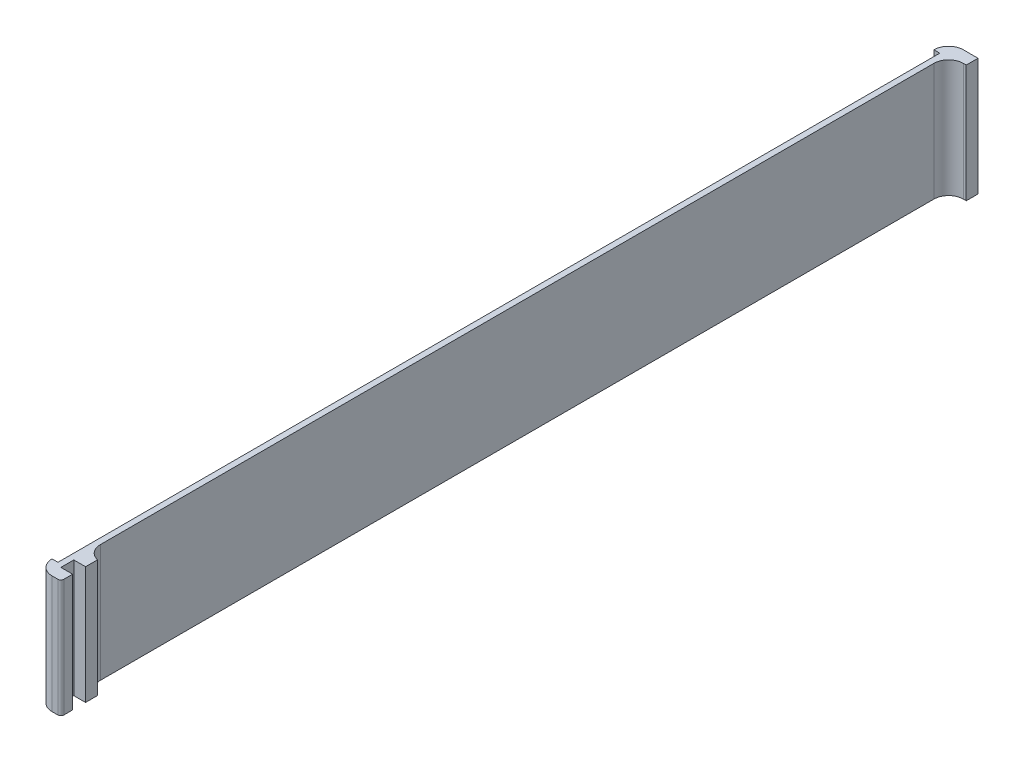
ISO-10303-21;
HEADER;
FILE_DESCRIPTION(('STEP AP214'),'2;1');
FILE_NAME('part.step','',(''),(''),'','','');
FILE_SCHEMA(('AUTOMOTIVE_DESIGN { 1 0 10303 214 1 1 1 1 }'));
ENDSEC;
DATA;
#1=APPLICATION_CONTEXT('core data for automotive mechanical design processes');
#2=APPLICATION_PROTOCOL_DEFINITION('international standard','automotive_design',2000,#1);
#3=PRODUCT_CONTEXT('',#1,'mechanical');
#4=PRODUCT('Part','Part','',(#3));
#5=PRODUCT_RELATED_PRODUCT_CATEGORY('part','',(#4));
#6=PRODUCT_DEFINITION_FORMATION('','',#4);
#7=PRODUCT_DEFINITION_CONTEXT('part definition',#1,'design');
#8=PRODUCT_DEFINITION('design','',#6,#7);
#9=PRODUCT_DEFINITION_SHAPE('','',#8);
#10=(LENGTH_UNIT() NAMED_UNIT(*) SI_UNIT(.MILLI.,.METRE.));
#11=(NAMED_UNIT(*) PLANE_ANGLE_UNIT() SI_UNIT($,.RADIAN.));
#12=(NAMED_UNIT(*) SI_UNIT($,.STERADIAN.) SOLID_ANGLE_UNIT());
#13=UNCERTAINTY_MEASURE_WITH_UNIT(LENGTH_MEASURE(1.E-05),#10,'distance_accuracy_value','');
#14=(GEOMETRIC_REPRESENTATION_CONTEXT(3) GLOBAL_UNCERTAINTY_ASSIGNED_CONTEXT((#13)) GLOBAL_UNIT_ASSIGNED_CONTEXT((#10,
#11,#12)) REPRESENTATION_CONTEXT('',''));
#15=CARTESIAN_POINT('',(0.,0.,0.));
#16=DIRECTION('',(0.,0.,1.));
#17=DIRECTION('',(1.,0.,0.));
#18=AXIS2_PLACEMENT_3D('',#15,#16,#17);
#19=CARTESIAN_POINT('',(-19.5,2.,-77.5));
#20=DIRECTION('',(0.,0.,1.));
#21=DIRECTION('',(1.,0.,0.));
#22=AXIS2_PLACEMENT_3D('',#19,#20,#21);
#23=PLANE('',#22);
#24=DIRECTION('',(0.,-1.,0.));
#25=VECTOR('',#24,1.);
#26=CARTESIAN_POINT('',(-17.,2.,-77.5));
#27=LINE('',#26,#25);
#28=CARTESIAN_POINT('',(-17.,10.,-77.5));
#29=VERTEX_POINT('',#28);
#30=CARTESIAN_POINT('',(-17.,30.,-77.5));
#31=VERTEX_POINT('',#30);
#32=EDGE_CURVE('E329',#29,#31,#27,.F.);
#33=ORIENTED_EDGE('',*,*,#32,.T.);
#34=DIRECTION('',(1.,0.,0.));
#35=VECTOR('',#34,1.);
#36=CARTESIAN_POINT('',(-19.5,30.,-77.5));
#37=LINE('',#36,#35);
#38=CARTESIAN_POINT('',(-14.5,30.,-77.5));
#39=VERTEX_POINT('',#38);
#40=EDGE_CURVE('E238',#31,#39,#37,.T.);
#41=ORIENTED_EDGE('',*,*,#40,.T.);
#42=DIRECTION('',(0.,-1.,0.));
#43=VECTOR('',#42,1.);
#44=CARTESIAN_POINT('',(-14.5,2.,-77.5));
#45=LINE('',#44,#43);
#46=CARTESIAN_POINT('',(-14.5,10.,-77.5));
#47=VERTEX_POINT('',#46);
#48=EDGE_CURVE('E311',#39,#47,#45,.T.);
#49=ORIENTED_EDGE('',*,*,#48,.T.);
#50=DIRECTION('',(1.,0.,0.));
#51=VECTOR('',#50,1.);
#52=CARTESIAN_POINT('',(-19.5,10.,-77.5));
#53=LINE('',#52,#51);
#54=EDGE_CURVE('E233',#29,#47,#53,.T.);
#55=ORIENTED_EDGE('',*,*,#54,.F.);
#56=EDGE_LOOP('',(#33,#41,#49,#55));
#57=FACE_BOUND('',#56,.T.);
#58=ADVANCED_FACE('F83',(#57),#23,.F.);
#59=CARTESIAN_POINT('',(-17.5,42.8284271247462,75.5));
#60=DIRECTION('',(0.,0.,1.));
#61=DIRECTION('',(1.,0.,0.));
#62=AXIS2_PLACEMENT_3D('',#59,#60,#61);
#63=PLANE('',#62);
#64=DIRECTION('',(0.,-1.,0.));
#65=VECTOR('',#64,1.);
#66=CARTESIAN_POINT('',(-17.5,42.8284271247462,75.5));
#67=LINE('',#66,#65);
#68=CARTESIAN_POINT('',(-17.5,30.,75.5));
#69=VERTEX_POINT('',#68);
#70=CARTESIAN_POINT('',(-17.5,9.99999999999998,75.5));
#71=VERTEX_POINT('',#70);
#72=EDGE_CURVE('E320',#69,#71,#67,.T.);
#73=ORIENTED_EDGE('',*,*,#72,.F.);
#74=DIRECTION('',(1.,0.,0.));
#75=VECTOR('',#74,1.);
#76=CARTESIAN_POINT('',(-17.5,30.,75.5));
#77=LINE('',#76,#75);
#78=CARTESIAN_POINT('',(-15.5,30.,75.5));
#79=VERTEX_POINT('',#78);
#80=EDGE_CURVE('E295',#69,#79,#77,.T.);
#81=ORIENTED_EDGE('',*,*,#80,.T.);
#82=DIRECTION('',(0.,-1.,0.));
#83=VECTOR('',#82,1.);
#84=CARTESIAN_POINT('',(-15.5,42.8284271247462,75.5));
#85=LINE('',#84,#83);
#86=CARTESIAN_POINT('',(-15.5,9.99999999999998,75.5));
#87=VERTEX_POINT('',#86);
#88=EDGE_CURVE('E321',#79,#87,#85,.T.);
#89=ORIENTED_EDGE('',*,*,#88,.T.);
#90=DIRECTION('',(-1.,0.,0.));
#91=VECTOR('',#90,1.);
#92=CARTESIAN_POINT('',(-17.5,9.99999999999998,75.5));
#93=LINE('',#92,#91);
#94=EDGE_CURVE('E266',#87,#71,#93,.T.);
#95=ORIENTED_EDGE('',*,*,#94,.T.);
#96=EDGE_LOOP('',(#73,#81,#89,#95));
#97=FACE_BOUND('',#96,.T.);
#98=ADVANCED_FACE('F382',(#97),#63,.F.);
#99=CARTESIAN_POINT('',(-19.5,2.,77.5));
#100=DIRECTION('',(0.,0.,-1.));
#101=DIRECTION('',(-1.,0.,0.));
#102=AXIS2_PLACEMENT_3D('',#99,#100,#101);
#103=PLANE('',#102);
#104=DIRECTION('',(0.,-1.,0.));
#105=VECTOR('',#104,1.);
#106=CARTESIAN_POINT('',(-16.,2.,77.5));
#107=LINE('',#106,#105);
#108=CARTESIAN_POINT('',(-16.,9.99999999999998,77.5));
#109=VERTEX_POINT('',#108);
#110=CARTESIAN_POINT('',(-16.,30.,77.5));
#111=VERTEX_POINT('',#110);
#112=EDGE_CURVE('E350',#109,#111,#107,.F.);
#113=ORIENTED_EDGE('',*,*,#112,.T.);
#114=DIRECTION('',(1.,0.,0.));
#115=VECTOR('',#114,1.);
#116=CARTESIAN_POINT('',(-19.5,30.,77.5));
#117=LINE('',#116,#115);
#118=CARTESIAN_POINT('',(-17.,30.,77.5));
#119=VERTEX_POINT('',#118);
#120=EDGE_CURVE('E242',#119,#111,#117,.T.);
#121=ORIENTED_EDGE('',*,*,#120,.F.);
#122=DIRECTION('',(0.,-1.,0.));
#123=VECTOR('',#122,1.);
#124=CARTESIAN_POINT('',(-17.,2.,77.5));
#125=LINE('',#124,#123);
#126=CARTESIAN_POINT('',(-17.,9.99999999999998,77.5));
#127=VERTEX_POINT('',#126);
#128=EDGE_CURVE('E324',#119,#127,#125,.T.);
#129=ORIENTED_EDGE('',*,*,#128,.T.);
#130=DIRECTION('',(1.,0.,0.));
#131=VECTOR('',#130,1.);
#132=CARTESIAN_POINT('',(-19.5,9.99999999999998,77.5));
#133=LINE('',#132,#131);
#134=EDGE_CURVE('E244',#127,#109,#133,.T.);
#135=ORIENTED_EDGE('',*,*,#134,.T.);
#136=EDGE_LOOP('',(#113,#121,#129,#135));
#137=FACE_BOUND('',#136,.T.);
#138=ADVANCED_FACE('F387',(#137),#103,.F.);
#139=CARTESIAN_POINT('',(-17.5,42.8284271247462,73.3));
#140=DIRECTION('',(0.,0.,-1.));
#141=DIRECTION('',(-1.,0.,0.));
#142=AXIS2_PLACEMENT_3D('',#139,#140,#141);
#143=PLANE('',#142);
#144=DIRECTION('',(0.,-1.,0.));
#145=VECTOR('',#144,1.);
#146=CARTESIAN_POINT('',(-15.5,42.8284271247462,73.3));
#147=LINE('',#146,#145);
#148=CARTESIAN_POINT('',(-15.5,30.,73.3));
#149=VERTEX_POINT('',#148);
#150=CARTESIAN_POINT('',(-15.5,9.99999999999998,73.3));
#151=VERTEX_POINT('',#150);
#152=EDGE_CURVE('E317',#149,#151,#147,.T.);
#153=ORIENTED_EDGE('',*,*,#152,.F.);
#154=DIRECTION('',(-1.,0.,0.));
#155=VECTOR('',#154,1.);
#156=CARTESIAN_POINT('',(-17.5,30.,73.3));
#157=LINE('',#156,#155);
#158=CARTESIAN_POINT('',(-17.5,30.,73.3));
#159=VERTEX_POINT('',#158);
#160=EDGE_CURVE('E290',#149,#159,#157,.T.);
#161=ORIENTED_EDGE('',*,*,#160,.T.);
#162=DIRECTION('',(0.,-1.,0.));
#163=VECTOR('',#162,1.);
#164=CARTESIAN_POINT('',(-17.5,42.8284271247462,73.3));
#165=LINE('',#164,#163);
#166=CARTESIAN_POINT('',(-17.5,9.99999999999998,73.3));
#167=VERTEX_POINT('',#166);
#168=EDGE_CURVE('E314',#159,#167,#165,.T.);
#169=ORIENTED_EDGE('',*,*,#168,.T.);
#170=DIRECTION('',(1.,0.,0.));
#171=VECTOR('',#170,1.);
#172=CARTESIAN_POINT('',(-17.5,9.99999999999998,73.3));
#173=LINE('',#172,#171);
#174=EDGE_CURVE('E261',#167,#151,#173,.T.);
#175=ORIENTED_EDGE('',*,*,#174,.T.);
#176=EDGE_LOOP('',(#153,#161,#169,#175));
#177=FACE_BOUND('',#176,.T.);
#178=ADVANCED_FACE('F392',(#177),#143,.F.);
#179=CARTESIAN_POINT('',(0.,40.,-75.5));
#180=DIRECTION('',(0.,0.,-1.));
#181=DIRECTION('',(-1.,0.,0.));
#182=AXIS2_PLACEMENT_3D('',#179,#180,#181);
#183=PLANE('',#182);
#184=DIRECTION('',(0.,1.,0.));
#185=VECTOR('',#184,1.);
#186=CARTESIAN_POINT('',(-14.5,40.,-75.5));
#187=LINE('',#186,#185);
#188=CARTESIAN_POINT('',(-14.5,10.,-75.5));
#189=VERTEX_POINT('',#188);
#190=CARTESIAN_POINT('',(-14.5,30.,-75.5));
#191=VERTEX_POINT('',#190);
#192=EDGE_CURVE('E308',#189,#191,#187,.T.);
#193=ORIENTED_EDGE('',*,*,#192,.T.);
#194=DIRECTION('',(-1.,0.,0.));
#195=VECTOR('',#194,1.);
#196=CARTESIAN_POINT('',(0.,30.,-75.5));
#197=LINE('',#196,#195);
#198=CARTESIAN_POINT('',(-15.,30.,-75.5));
#199=VERTEX_POINT('',#198);
#200=EDGE_CURVE('E106',#191,#199,#197,.T.);
#201=ORIENTED_EDGE('',*,*,#200,.T.);
#202=DIRECTION('',(0.,-1.,0.));
#203=VECTOR('',#202,1.);
#204=CARTESIAN_POINT('',(-15.,40.,-75.5));
#205=LINE('',#204,#203);
#206=CARTESIAN_POINT('',(-15.,10.,-75.5));
#207=VERTEX_POINT('',#206);
#208=EDGE_CURVE('E341',#199,#207,#205,.T.);
#209=ORIENTED_EDGE('',*,*,#208,.T.);
#210=DIRECTION('',(1.,0.,0.));
#211=VECTOR('',#210,1.);
#212=CARTESIAN_POINT('',(0.,10.,-75.5));
#213=LINE('',#212,#211);
#214=EDGE_CURVE('E241',#207,#189,#213,.T.);
#215=ORIENTED_EDGE('',*,*,#214,.T.);
#216=EDGE_LOOP('',(#193,#201,#209,#215));
#217=FACE_BOUND('',#216,.T.);
#218=ADVANCED_FACE('F395',(#217),#183,.F.);
#219=CARTESIAN_POINT('',(-15.,40.,-73.));
#220=DIRECTION('',(0.,-1.,0.));
#221=DIRECTION('',(0.,0.,-1.));
#222=AXIS2_PLACEMENT_3D('',#219,#220,#221);
#223=CYLINDRICAL_SURFACE('',#222,2.5);
#224=ORIENTED_EDGE('',*,*,#208,.F.);
#225=CARTESIAN_POINT('',(-15.,30.,-73.));
#226=DIRECTION('',(0.,-1.,0.));
#227=DIRECTION('',(0.,0.,-1.));
#228=AXIS2_PLACEMENT_3D('',#225,#226,#227);
#229=CIRCLE('',#228,2.5);
#230=CARTESIAN_POINT('',(-17.5,30.,-73.));
#231=VERTEX_POINT('',#230);
#232=EDGE_CURVE('E279',#199,#231,#229,.F.);
#233=ORIENTED_EDGE('',*,*,#232,.T.);
#234=DIRECTION('',(0.,-1.,0.));
#235=VECTOR('',#234,1.);
#236=CARTESIAN_POINT('',(-17.5,40.,-73.));
#237=LINE('',#236,#235);
#238=CARTESIAN_POINT('',(-17.5,10.,-73.));
#239=VERTEX_POINT('',#238);
#240=EDGE_CURVE('E335',#239,#231,#237,.F.);
#241=ORIENTED_EDGE('',*,*,#240,.F.);
#242=CARTESIAN_POINT('',(-15.,10.,-73.));
#243=DIRECTION('',(0.,1.,0.));
#244=DIRECTION('',(0.,0.,1.));
#245=AXIS2_PLACEMENT_3D('',#242,#243,#244);
#246=CIRCLE('',#245,2.5);
#247=EDGE_CURVE('E250',#239,#207,#246,.F.);
#248=ORIENTED_EDGE('',*,*,#247,.T.);
#249=EDGE_LOOP('',(#224,#233,#241,#248));
#250=FACE_BOUND('',#249,.T.);
#251=ADVANCED_FACE('F398',(#250),#223,.F.);
#252=CARTESIAN_POINT('',(-17.5,40.,0.));
#253=DIRECTION('',(1.,0.,0.));
#254=DIRECTION('',(0.,0.,-1.));
#255=AXIS2_PLACEMENT_3D('',#252,#253,#254);
#256=PLANE('',#255);
#257=DIRECTION('',(0.,0.,-1.));
#258=VECTOR('',#257,1.);
#259=CARTESIAN_POINT('',(-17.5,30.,0.));
#260=LINE('',#259,#258);
#261=EDGE_CURVE('E293',#69,#159,#260,.T.);
#262=ORIENTED_EDGE('',*,*,#261,.F.);
#263=ORIENTED_EDGE('',*,*,#72,.T.);
#264=DIRECTION('',(0.,0.,1.));
#265=VECTOR('',#264,1.);
#266=CARTESIAN_POINT('',(-17.5,9.99999999999999,0.));
#267=LINE('',#266,#265);
#268=EDGE_CURVE('E264',#167,#71,#267,.T.);
#269=ORIENTED_EDGE('',*,*,#268,.F.);
#270=ORIENTED_EDGE('',*,*,#168,.F.);
#271=EDGE_LOOP('',(#262,#263,#269,#270));
#272=FACE_BOUND('',#271,.T.);
#273=ADVANCED_FACE('F379',(#272),#256,.T.);
#274=CARTESIAN_POINT('',(-15.5,42.8284271247462,77.5));
#275=DIRECTION('',(-1.,0.,0.));
#276=DIRECTION('',(0.,0.,1.));
#277=AXIS2_PLACEMENT_3D('',#274,#275,#276);
#278=PLANE('',#277);
#279=DIRECTION('',(0.,-1.,0.));
#280=VECTOR('',#279,1.);
#281=CARTESIAN_POINT('',(-15.5,4.,71.2494897427832));
#282=LINE('',#281,#280);
#283=CARTESIAN_POINT('',(-15.5,9.99999999999998,71.2494897427832));
#284=VERTEX_POINT('',#283);
#285=CARTESIAN_POINT('',(-15.5,30.,71.2494897427832));
#286=VERTEX_POINT('',#285);
#287=EDGE_CURVE('E344',#284,#286,#282,.F.);
#288=ORIENTED_EDGE('',*,*,#287,.T.);
#289=DIRECTION('',(0.,0.,1.));
#290=VECTOR('',#289,1.);
#291=CARTESIAN_POINT('',(-15.5,30.,77.5));
#292=LINE('',#291,#290);
#293=EDGE_CURVE('E287',#286,#149,#292,.T.);
#294=ORIENTED_EDGE('',*,*,#293,.T.);
#295=ORIENTED_EDGE('',*,*,#152,.T.);
#296=DIRECTION('',(0.,0.,-1.));
#297=VECTOR('',#296,1.);
#298=CARTESIAN_POINT('',(-15.5,9.99999999999998,77.5));
#299=LINE('',#298,#297);
#300=EDGE_CURVE('E258',#151,#284,#299,.T.);
#301=ORIENTED_EDGE('',*,*,#300,.T.);
#302=EDGE_LOOP('',(#288,#294,#295,#301));
#303=FACE_BOUND('',#302,.T.);
#304=ADVANCED_FACE('F400',(#303),#278,.F.);
#305=ORIENTED_EDGE('',*,*,#88,.F.);
#306=DIRECTION('',(0.,0.,1.));
#307=VECTOR('',#306,1.);
#308=CARTESIAN_POINT('',(-15.5,30.,77.5));
#309=LINE('',#308,#307);
#310=CARTESIAN_POINT('',(-15.5,30.,77.));
#311=VERTEX_POINT('',#310);
#312=EDGE_CURVE('E298',#79,#311,#309,.T.);
#313=ORIENTED_EDGE('',*,*,#312,.T.);
#314=DIRECTION('',(0.,-1.,0.));
#315=VECTOR('',#314,1.);
#316=CARTESIAN_POINT('',(-15.5,42.8284271247462,77.));
#317=LINE('',#316,#315);
#318=CARTESIAN_POINT('',(-15.5,9.99999999999998,77.));
#319=VERTEX_POINT('',#318);
#320=EDGE_CURVE('E347',#311,#319,#317,.T.);
#321=ORIENTED_EDGE('',*,*,#320,.T.);
#322=DIRECTION('',(0.,0.,-1.));
#323=VECTOR('',#322,1.);
#324=CARTESIAN_POINT('',(-15.5,9.99999999999998,77.5));
#325=LINE('',#324,#323);
#326=EDGE_CURVE('E269',#319,#87,#325,.T.);
#327=ORIENTED_EDGE('',*,*,#326,.T.);
#328=EDGE_LOOP('',(#305,#313,#321,#327));
#329=FACE_BOUND('',#328,.T.);
#330=ADVANCED_FACE('F376',(#329),#278,.F.);
#331=DIRECTION('',(0.,0.,-1.));
#332=VECTOR('',#331,1.);
#333=CARTESIAN_POINT('',(-17.5,30.,0.));
#334=LINE('',#333,#332);
#335=CARTESIAN_POINT('',(-17.5,30.,68.8));
#336=VERTEX_POINT('',#335);
#337=EDGE_CURVE('E282',#336,#231,#334,.T.);
#338=ORIENTED_EDGE('',*,*,#337,.F.);
#339=DIRECTION('',(0.,-1.,0.));
#340=VECTOR('',#339,1.);
#341=CARTESIAN_POINT('',(-17.5,40.,68.8));
#342=LINE('',#341,#340);
#343=CARTESIAN_POINT('',(-17.5,9.99999999999998,68.8));
#344=VERTEX_POINT('',#343);
#345=EDGE_CURVE('E338',#336,#344,#342,.T.);
#346=ORIENTED_EDGE('',*,*,#345,.T.);
#347=DIRECTION('',(0.,0.,1.));
#348=VECTOR('',#347,1.);
#349=CARTESIAN_POINT('',(-17.5,9.99999999999999,0.));
#350=LINE('',#349,#348);
#351=EDGE_CURVE('E253',#239,#344,#350,.T.);
#352=ORIENTED_EDGE('',*,*,#351,.F.);
#353=ORIENTED_EDGE('',*,*,#240,.T.);
#354=EDGE_LOOP('',(#338,#346,#352,#353));
#355=FACE_BOUND('',#354,.T.);
#356=ADVANCED_FACE('F366',(#355),#256,.T.);
#357=CARTESIAN_POINT('',(-17.,2.,-75.));
#358=DIRECTION('',(0.,-1.,0.));
#359=DIRECTION('',(0.,0.,-1.));
#360=AXIS2_PLACEMENT_3D('',#357,#358,#359);
#361=CYLINDRICAL_SURFACE('',#360,2.5);
#362=CARTESIAN_POINT('',(-17.,30.,-75.));
#363=DIRECTION('',(0.,-1.,0.));
#364=DIRECTION('',(0.,0.,-1.));
#365=AXIS2_PLACEMENT_3D('',#362,#363,#364);
#366=CIRCLE('',#365,2.5);
#367=CARTESIAN_POINT('',(-19.5,30.,-75.));
#368=VERTEX_POINT('',#367);
#369=EDGE_CURVE('E305',#31,#368,#366,.F.);
#370=ORIENTED_EDGE('',*,*,#369,.F.);
#371=ORIENTED_EDGE('',*,*,#32,.F.);
#372=CARTESIAN_POINT('',(-17.,10.,-75.));
#373=DIRECTION('',(0.,1.,0.));
#374=DIRECTION('',(0.,0.,1.));
#375=AXIS2_PLACEMENT_3D('',#372,#373,#374);
#376=CIRCLE('',#375,2.5);
#377=CARTESIAN_POINT('',(-19.5,9.99999999999998,-75.));
#378=VERTEX_POINT('',#377);
#379=EDGE_CURVE('E276',#378,#29,#376,.F.);
#380=ORIENTED_EDGE('',*,*,#379,.F.);
#381=DIRECTION('',(0.,-1.,0.));
#382=VECTOR('',#381,1.);
#383=CARTESIAN_POINT('',(-19.5,2.,-75.));
#384=LINE('',#383,#382);
#385=EDGE_CURVE('E212',#368,#378,#384,.T.);
#386=ORIENTED_EDGE('',*,*,#385,.F.);
#387=EDGE_LOOP('',(#370,#371,#380,#386));
#388=FACE_BOUND('',#387,.T.);
#389=ADVANCED_FACE('F363',(#388),#361,.T.);
#390=CARTESIAN_POINT('',(-17.,2.,75.));
#391=DIRECTION('',(0.,-1.,0.));
#392=DIRECTION('',(0.,0.,-1.));
#393=AXIS2_PLACEMENT_3D('',#390,#391,#392);
#394=CYLINDRICAL_SURFACE('',#393,2.5);
#395=CARTESIAN_POINT('',(-17.,30.,75.));
#396=DIRECTION('',(0.,-1.,0.));
#397=DIRECTION('',(0.,0.,-1.));
#398=AXIS2_PLACEMENT_3D('',#395,#396,#397);
#399=CIRCLE('',#398,2.5);
#400=CARTESIAN_POINT('',(-19.5,30.,75.));
#401=VERTEX_POINT('',#400);
#402=EDGE_CURVE('E303',#401,#119,#399,.F.);
#403=ORIENTED_EDGE('',*,*,#402,.F.);
#404=DIRECTION('',(0.,-1.,0.));
#405=VECTOR('',#404,1.);
#406=CARTESIAN_POINT('',(-19.5,2.,75.));
#407=LINE('',#406,#405);
#408=CARTESIAN_POINT('',(-19.5,9.99999999999998,75.));
#409=VERTEX_POINT('',#408);
#410=EDGE_CURVE('E333',#409,#401,#407,.F.);
#411=ORIENTED_EDGE('',*,*,#410,.F.);
#412=CARTESIAN_POINT('',(-17.,9.99999999999998,75.));
#413=DIRECTION('',(0.,1.,0.));
#414=DIRECTION('',(0.,0.,1.));
#415=AXIS2_PLACEMENT_3D('',#412,#413,#414);
#416=CIRCLE('',#415,2.5);
#417=EDGE_CURVE('E274',#127,#409,#416,.F.);
#418=ORIENTED_EDGE('',*,*,#417,.F.);
#419=ORIENTED_EDGE('',*,*,#128,.F.);
#420=EDGE_LOOP('',(#403,#411,#418,#419));
#421=FACE_BOUND('',#420,.T.);
#422=ADVANCED_FACE('F365',(#421),#394,.T.);
#423=CARTESIAN_POINT('',(-15.,40.,68.8));
#424=DIRECTION('',(0.,-1.,0.));
#425=DIRECTION('',(0.,0.,-1.));
#426=AXIS2_PLACEMENT_3D('',#423,#424,#425);
#427=CYLINDRICAL_SURFACE('',#426,2.5);
#428=ORIENTED_EDGE('',*,*,#345,.F.);
#429=CARTESIAN_POINT('',(-15.,30.,68.8));
#430=DIRECTION('',(0.,-1.,0.));
#431=DIRECTION('',(0.,0.,-1.));
#432=AXIS2_PLACEMENT_3D('',#429,#430,#431);
#433=CIRCLE('',#432,2.5);
#434=EDGE_CURVE('E284',#336,#286,#433,.F.);
#435=ORIENTED_EDGE('',*,*,#434,.T.);
#436=ORIENTED_EDGE('',*,*,#287,.F.);
#437=CARTESIAN_POINT('',(-15.,9.99999999999998,68.8));
#438=DIRECTION('',(0.,1.,0.));
#439=DIRECTION('',(0.,0.,1.));
#440=AXIS2_PLACEMENT_3D('',#437,#438,#439);
#441=CIRCLE('',#440,2.5);
#442=EDGE_CURVE('E255',#284,#344,#441,.F.);
#443=ORIENTED_EDGE('',*,*,#442,.T.);
#444=EDGE_LOOP('',(#428,#435,#436,#443));
#445=FACE_BOUND('',#444,.T.);
#446=ADVANCED_FACE('F372',(#445),#427,.F.);
#447=CARTESIAN_POINT('',(-16.,42.8284271247462,77.));
#448=DIRECTION('',(0.,-1.,0.));
#449=DIRECTION('',(0.,0.,-1.));
#450=AXIS2_PLACEMENT_3D('',#447,#448,#449);
#451=CYLINDRICAL_SURFACE('',#450,0.5);
#452=CARTESIAN_POINT('',(-16.,30.,77.));
#453=DIRECTION('',(0.,-1.,0.));
#454=DIRECTION('',(0.,0.,-1.));
#455=AXIS2_PLACEMENT_3D('',#452,#453,#454);
#456=CIRCLE('',#455,0.5);
#457=EDGE_CURVE('E301',#111,#311,#456,.F.);
#458=ORIENTED_EDGE('',*,*,#457,.F.);
#459=ORIENTED_EDGE('',*,*,#112,.F.);
#460=CARTESIAN_POINT('',(-16.,9.99999999999998,77.));
#461=DIRECTION('',(0.,1.,0.));
#462=DIRECTION('',(0.,0.,1.));
#463=AXIS2_PLACEMENT_3D('',#460,#461,#462);
#464=CIRCLE('',#463,0.5);
#465=EDGE_CURVE('E272',#319,#109,#464,.F.);
#466=ORIENTED_EDGE('',*,*,#465,.F.);
#467=ORIENTED_EDGE('',*,*,#320,.F.);
#468=EDGE_LOOP('',(#458,#459,#466,#467));
#469=FACE_BOUND('',#468,.T.);
#470=ADVANCED_FACE('F85',(#469),#451,.T.);
#471=CARTESIAN_POINT('',(-14.5,9.,-77.5353460179952));
#472=DIRECTION('',(-1.,0.,0.));
#473=DIRECTION('',(0.,0.,1.));
#474=AXIS2_PLACEMENT_3D('',#471,#472,#473);
#475=PLANE('',#474);
#476=ORIENTED_EDGE('',*,*,#48,.F.);
#477=DIRECTION('',(0.,0.,1.));
#478=VECTOR('',#477,1.);
#479=CARTESIAN_POINT('',(-14.5,30.,-77.5353460179952));
#480=LINE('',#479,#478);
#481=EDGE_CURVE('E12',#39,#191,#480,.T.);
#482=ORIENTED_EDGE('',*,*,#481,.T.);
#483=ORIENTED_EDGE('',*,*,#192,.F.);
#484=DIRECTION('',(0.,0.,-1.));
#485=VECTOR('',#484,1.);
#486=CARTESIAN_POINT('',(-14.5,10.,-77.5353460179952));
#487=LINE('',#486,#485);
#488=EDGE_CURVE('E91',#189,#47,#487,.T.);
#489=ORIENTED_EDGE('',*,*,#488,.T.);
#490=EDGE_LOOP('',(#476,#482,#483,#489));
#491=FACE_BOUND('',#490,.T.);
#492=ADVANCED_FACE('F356',(#491),#475,.F.);
#493=CARTESIAN_POINT('',(-19.5,9.99999999999999,0.));
#494=DIRECTION('',(0.,1.,0.));
#495=DIRECTION('',(0.,0.,1.));
#496=AXIS2_PLACEMENT_3D('',#493,#494,#495);
#497=PLANE('',#496);
#498=DIRECTION('',(0.,0.,1.));
#499=VECTOR('',#498,1.);
#500=CARTESIAN_POINT('',(-18.5,9.99999999999998,-75.));
#501=LINE('',#500,#499);
#502=CARTESIAN_POINT('',(-18.5,9.99999999999998,-75.));
#503=VERTEX_POINT('',#502);
#504=CARTESIAN_POINT('',(-18.5,9.99999999999998,75.));
#505=VERTEX_POINT('',#504);
#506=EDGE_CURVE('E220',#503,#505,#501,.T.);
#507=ORIENTED_EDGE('',*,*,#506,.F.);
#508=DIRECTION('',(-1.,0.,0.));
#509=VECTOR('',#508,1.);
#510=CARTESIAN_POINT('',(-18.5,9.99999999999998,-75.));
#511=LINE('',#510,#509);
#512=EDGE_CURVE('E207',#503,#378,#511,.T.);
#513=ORIENTED_EDGE('',*,*,#512,.T.);
#514=ORIENTED_EDGE('',*,*,#379,.T.);
#515=ORIENTED_EDGE('',*,*,#54,.T.);
#516=ORIENTED_EDGE('',*,*,#488,.F.);
#517=ORIENTED_EDGE('',*,*,#214,.F.);
#518=ORIENTED_EDGE('',*,*,#247,.F.);
#519=ORIENTED_EDGE('',*,*,#351,.T.);
#520=ORIENTED_EDGE('',*,*,#442,.F.);
#521=ORIENTED_EDGE('',*,*,#300,.F.);
#522=ORIENTED_EDGE('',*,*,#174,.F.);
#523=ORIENTED_EDGE('',*,*,#268,.T.);
#524=ORIENTED_EDGE('',*,*,#94,.F.);
#525=ORIENTED_EDGE('',*,*,#326,.F.);
#526=ORIENTED_EDGE('',*,*,#465,.T.);
#527=ORIENTED_EDGE('',*,*,#134,.F.);
#528=ORIENTED_EDGE('',*,*,#417,.T.);
#529=DIRECTION('',(-1.,0.,0.));
#530=VECTOR('',#529,1.);
#531=CARTESIAN_POINT('',(-18.5,9.99999999999998,75.));
#532=LINE('',#531,#530);
#533=EDGE_CURVE('E216',#505,#409,#532,.T.);
#534=ORIENTED_EDGE('',*,*,#533,.F.);
#535=EDGE_LOOP('',(#507,#513,#514,#515,#516,#517,#518,#519,#520,#521,#522,#523,#524,#525,#526,
#527,#528,#534));
#536=FACE_BOUND('',#535,.T.);
#537=ADVANCED_FACE('F225',(#536),#497,.F.);
#538=CARTESIAN_POINT('',(-19.5,30.,0.));
#539=DIRECTION('',(0.,-1.,0.));
#540=DIRECTION('',(0.,0.,-1.));
#541=AXIS2_PLACEMENT_3D('',#538,#539,#540);
#542=PLANE('',#541);
#543=ORIENTED_EDGE('',*,*,#369,.T.);
#544=DIRECTION('',(-1.,0.,0.));
#545=VECTOR('',#544,1.);
#546=CARTESIAN_POINT('',(-18.5,30.,-75.));
#547=LINE('',#546,#545);
#548=CARTESIAN_POINT('',(-18.5,30.,-75.));
#549=VERTEX_POINT('',#548);
#550=EDGE_CURVE('E231',#549,#368,#547,.T.);
#551=ORIENTED_EDGE('',*,*,#550,.F.);
#552=DIRECTION('',(0.,0.,-1.));
#553=VECTOR('',#552,1.);
#554=CARTESIAN_POINT('',(-18.5,30.,-75.));
#555=LINE('',#554,#553);
#556=CARTESIAN_POINT('',(-18.5,30.,75.));
#557=VERTEX_POINT('',#556);
#558=EDGE_CURVE('E217',#557,#549,#555,.T.);
#559=ORIENTED_EDGE('',*,*,#558,.F.);
#560=DIRECTION('',(-1.,0.,0.));
#561=VECTOR('',#560,1.);
#562=CARTESIAN_POINT('',(-18.5,30.,75.));
#563=LINE('',#562,#561);
#564=EDGE_CURVE('E234',#557,#401,#563,.T.);
#565=ORIENTED_EDGE('',*,*,#564,.T.);
#566=ORIENTED_EDGE('',*,*,#402,.T.);
#567=ORIENTED_EDGE('',*,*,#120,.T.);
#568=ORIENTED_EDGE('',*,*,#457,.T.);
#569=ORIENTED_EDGE('',*,*,#312,.F.);
#570=ORIENTED_EDGE('',*,*,#80,.F.);
#571=ORIENTED_EDGE('',*,*,#261,.T.);
#572=ORIENTED_EDGE('',*,*,#160,.F.);
#573=ORIENTED_EDGE('',*,*,#293,.F.);
#574=ORIENTED_EDGE('',*,*,#434,.F.);
#575=ORIENTED_EDGE('',*,*,#337,.T.);
#576=ORIENTED_EDGE('',*,*,#232,.F.);
#577=ORIENTED_EDGE('',*,*,#200,.F.);
#578=ORIENTED_EDGE('',*,*,#481,.F.);
#579=ORIENTED_EDGE('',*,*,#40,.F.);
#580=EDGE_LOOP('',(#543,#551,#559,#565,#566,#567,#568,#569,#570,#571,#572,#573,#574,#575,#576,
#577,#578,#579));
#581=FACE_BOUND('',#580,.T.);
#582=ADVANCED_FACE('F361',(#581),#542,.F.);
#583=CARTESIAN_POINT('',(-18.5,30.,-75.));
#584=DIRECTION('',(0.,0.,-1.));
#585=DIRECTION('',(-1.,0.,0.));
#586=AXIS2_PLACEMENT_3D('',#583,#584,#585);
#587=PLANE('',#586);
#588=ORIENTED_EDGE('',*,*,#385,.T.);
#589=ORIENTED_EDGE('',*,*,#512,.F.);
#590=DIRECTION('',(0.,-1.,0.));
#591=VECTOR('',#590,1.);
#592=CARTESIAN_POINT('',(-18.5,30.,-75.));
#593=LINE('',#592,#591);
#594=EDGE_CURVE('E210',#549,#503,#593,.T.);
#595=ORIENTED_EDGE('',*,*,#594,.F.);
#596=ORIENTED_EDGE('',*,*,#550,.T.);
#597=EDGE_LOOP('',(#588,#589,#595,#596));
#598=FACE_BOUND('',#597,.T.);
#599=ADVANCED_FACE('F209',(#598),#587,.F.);
#600=CARTESIAN_POINT('',(-18.5,30.,75.));
#601=DIRECTION('',(0.,0.,1.));
#602=DIRECTION('',(1.,0.,0.));
#603=AXIS2_PLACEMENT_3D('',#600,#601,#602);
#604=PLANE('',#603);
#605=ORIENTED_EDGE('',*,*,#410,.T.);
#606=ORIENTED_EDGE('',*,*,#564,.F.);
#607=DIRECTION('',(0.,1.,0.));
#608=VECTOR('',#607,1.);
#609=CARTESIAN_POINT('',(-18.5,30.,75.));
#610=LINE('',#609,#608);
#611=EDGE_CURVE('E98',#505,#557,#610,.T.);
#612=ORIENTED_EDGE('',*,*,#611,.F.);
#613=ORIENTED_EDGE('',*,*,#533,.T.);
#614=EDGE_LOOP('',(#605,#606,#612,#613));
#615=FACE_BOUND('',#614,.T.);
#616=ADVANCED_FACE('F414',(#615),#604,.F.);
#617=CARTESIAN_POINT('',(-18.5,0.,0.));
#618=DIRECTION('',(-1.,0.,0.));
#619=DIRECTION('',(0.,0.,1.));
#620=AXIS2_PLACEMENT_3D('',#617,#618,#619);
#621=PLANE('',#620);
#622=ORIENTED_EDGE('',*,*,#594,.T.);
#623=ORIENTED_EDGE('',*,*,#506,.T.);
#624=ORIENTED_EDGE('',*,*,#611,.T.);
#625=ORIENTED_EDGE('',*,*,#558,.T.);
#626=EDGE_LOOP('',(#622,#623,#624,#625));
#627=FACE_BOUND('',#626,.T.);
#628=ADVANCED_FACE('F219',(#627),#621,.T.);
#629=CLOSED_SHELL('',(#58,#98,#138,#178,#218,#251,#273,#304,#330,#356,#389,#422,#446,#470,#492,
#537,#582,#599,#616,#628));
#630=MANIFOLD_SOLID_BREP('B2',#629);
#631=ADVANCED_BREP_SHAPE_REPRESENTATION('',(#18,#630),#14);
#632=SHAPE_DEFINITION_REPRESENTATION(#9,#631);
ENDSEC;
END-ISO-10303-21;
